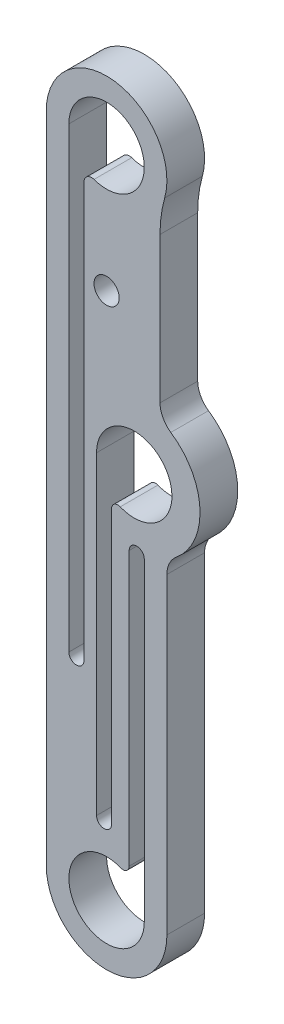
ISO-10303-21;
HEADER;
FILE_DESCRIPTION(('STEP AP214'),'2;1');
FILE_NAME('part.step','',(''),(''),'','','');
FILE_SCHEMA(('AUTOMOTIVE_DESIGN { 1 0 10303 214 1 1 1 1 }'));
ENDSEC;
DATA;
#1=APPLICATION_CONTEXT('core data for automotive mechanical design processes');
#2=APPLICATION_PROTOCOL_DEFINITION('international standard','automotive_design',2000,#1);
#3=PRODUCT_CONTEXT('',#1,'mechanical');
#4=PRODUCT('Part','Part','',(#3));
#5=PRODUCT_RELATED_PRODUCT_CATEGORY('part','',(#4));
#6=PRODUCT_DEFINITION_FORMATION('','',#4);
#7=PRODUCT_DEFINITION_CONTEXT('part definition',#1,'design');
#8=PRODUCT_DEFINITION('design','',#6,#7);
#9=PRODUCT_DEFINITION_SHAPE('','',#8);
#10=(LENGTH_UNIT() NAMED_UNIT(*) SI_UNIT(.MILLI.,.METRE.));
#11=(NAMED_UNIT(*) PLANE_ANGLE_UNIT() SI_UNIT($,.RADIAN.));
#12=(NAMED_UNIT(*) SI_UNIT($,.STERADIAN.) SOLID_ANGLE_UNIT());
#13=UNCERTAINTY_MEASURE_WITH_UNIT(LENGTH_MEASURE(1.E-05),#10,'distance_accuracy_value','');
#14=(GEOMETRIC_REPRESENTATION_CONTEXT(3) GLOBAL_UNCERTAINTY_ASSIGNED_CONTEXT((#13)) GLOBAL_UNIT_ASSIGNED_CONTEXT((#10,
#11,#12)) REPRESENTATION_CONTEXT('',''));
#15=CARTESIAN_POINT('',(0.,0.,0.));
#16=DIRECTION('',(0.,0.,1.));
#17=DIRECTION('',(1.,0.,0.));
#18=AXIS2_PLACEMENT_3D('',#15,#16,#17);
#19=CARTESIAN_POINT('',(-379.175961005545,89.3777291781797,3.));
#20=DIRECTION('',(0.,0.,1.));
#21=DIRECTION('',(1.,0.,0.));
#22=AXIS2_PLACEMENT_3D('',#19,#20,#21);
#23=PLANE('',#22);
#24=CARTESIAN_POINT('',(-379.175961005545,37.3777291781797,3.));
#25=DIRECTION('',(0.,0.,1.));
#26=DIRECTION('',(1.,0.,0.));
#27=AXIS2_PLACEMENT_3D('',#24,#25,#26);
#28=CIRCLE('',#27,3.00000000000003);
#29=CARTESIAN_POINT('',(-378.061675291259,40.1631137740549,3.));
#30=VERTEX_POINT('',#29);
#31=CARTESIAN_POINT('',(-376.175961005545,37.3777291781797,3.));
#32=VERTEX_POINT('',#31);
#33=EDGE_CURVE('E286',#30,#32,#28,.T.);
#34=ORIENTED_EDGE('',*,*,#33,.F.);
#35=CARTESIAN_POINT('',(-377.875961005545,40.6273445400341,3.));
#36=DIRECTION('',(0.,0.,-1.));
#37=DIRECTION('',(-1.,0.,0.));
#38=AXIS2_PLACEMENT_3D('',#35,#36,#37);
#39=CIRCLE('',#38,0.499999999999999);
#40=CARTESIAN_POINT('',(-377.375961005545,40.6273445400341,3.));
#41=VERTEX_POINT('',#40);
#42=EDGE_CURVE('E284',#41,#30,#39,.T.);
#43=ORIENTED_EDGE('',*,*,#42,.F.);
#44=DIRECTION('',(0.,-1.,0.));
#45=VECTOR('',#44,1.);
#46=CARTESIAN_POINT('',(-377.375961005545,62.3777291781797,3.));
#47=LINE('',#46,#45);
#48=CARTESIAN_POINT('',(-377.375961005545,62.3777291781797,3.));
#49=VERTEX_POINT('',#48);
#50=EDGE_CURVE('E294',#49,#41,#47,.T.);
#51=ORIENTED_EDGE('',*,*,#50,.F.);
#52=CARTESIAN_POINT('',(-376.775961005545,62.3777291781797,3.));
#53=DIRECTION('',(0.,0.,1.));
#54=DIRECTION('',(1.,0.,0.));
#55=AXIS2_PLACEMENT_3D('',#52,#53,#54);
#56=CIRCLE('',#55,0.600000000000017);
#57=CARTESIAN_POINT('',(-376.175961005545,62.3777291781797,3.));
#58=VERTEX_POINT('',#57);
#59=EDGE_CURVE('E291',#58,#49,#56,.T.);
#60=ORIENTED_EDGE('',*,*,#59,.F.);
#61=DIRECTION('',(0.,1.,0.));
#62=VECTOR('',#61,1.);
#63=CARTESIAN_POINT('',(-376.175961005545,37.3777291781797,3.));
#64=LINE('',#63,#62);
#65=EDGE_CURVE('E289',#32,#58,#64,.T.);
#66=ORIENTED_EDGE('',*,*,#65,.F.);
#67=EDGE_LOOP('',(#34,#43,#51,#60,#66));
#68=FACE_BOUND('',#67,.T.);
#69=CARTESIAN_POINT('',(-379.175961005545,89.3777291781797,3.));
#70=DIRECTION('',(0.,0.,1.));
#71=DIRECTION('',(1.,0.,0.));
#72=AXIS2_PLACEMENT_3D('',#69,#70,#71);
#73=CIRCLE('',#72,4.79999999999992);
#74=CARTESIAN_POINT('',(-374.554571082855,88.080518639191,3.));
#75=VERTEX_POINT('',#74);
#76=CARTESIAN_POINT('',(-383.975961005545,89.3777291781797,3.));
#77=VERTEX_POINT('',#76);
#78=EDGE_CURVE('E322',#75,#77,#73,.T.);
#79=ORIENTED_EDGE('',*,*,#78,.T.);
#80=DIRECTION('',(0.,-1.,0.));
#81=VECTOR('',#80,1.);
#82=CARTESIAN_POINT('',(-383.975961005545,89.3777291781797,3.));
#83=LINE('',#82,#81);
#84=CARTESIAN_POINT('',(-383.975961005545,37.3777291781797,3.));
#85=VERTEX_POINT('',#84);
#86=EDGE_CURVE('E325',#77,#85,#83,.T.);
#87=ORIENTED_EDGE('',*,*,#86,.T.);
#88=CARTESIAN_POINT('',(-379.175961005545,37.3777291781797,3.));
#89=DIRECTION('',(0.,0.,1.));
#90=DIRECTION('',(1.,0.,0.));
#91=AXIS2_PLACEMENT_3D('',#88,#89,#90);
#92=CIRCLE('',#91,4.80000000000008);
#93=CARTESIAN_POINT('',(-374.375961005544,37.3777291781797,3.));
#94=VERTEX_POINT('',#93);
#95=EDGE_CURVE('E328',#85,#94,#92,.T.);
#96=ORIENTED_EDGE('',*,*,#95,.T.);
#97=DIRECTION('',(0.,1.,0.));
#98=VECTOR('',#97,1.);
#99=CARTESIAN_POINT('',(-374.375961005544,37.3777291781797,3.));
#100=LINE('',#99,#98);
#101=CARTESIAN_POINT('',(-374.375961005545,62.2241193920529,3.));
#102=VERTEX_POINT('',#101);
#103=EDGE_CURVE('E330',#94,#102,#100,.T.);
#104=ORIENTED_EDGE('',*,*,#103,.T.);
#105=CARTESIAN_POINT('',(-372.375961005545,62.2241193920529,3.));
#106=DIRECTION('',(0.,0.,-1.));
#107=DIRECTION('',(1.,0.,0.));
#108=AXIS2_PLACEMENT_3D('',#105,#106,#107);
#109=CIRCLE('',#108,1.99999999999996);
#110=CARTESIAN_POINT('',(-373.647205362335,63.7681199702032,3.));
#111=VERTEX_POINT('',#110);
#112=EDGE_CURVE('E332',#102,#111,#109,.T.);
#113=ORIENTED_EDGE('',*,*,#112,.T.);
#114=CARTESIAN_POINT('',(-376.975961005545,67.8110882714461,3.));
#115=DIRECTION('',(0.,0.,1.));
#116=DIRECTION('',(1.,0.,0.));
#117=AXIS2_PLACEMENT_3D('',#114,#115,#116);
#118=CIRCLE('',#117,5.23700361056355);
#119=CARTESIAN_POINT('',(-374.066514555231,72.1655489923408,3.));
#120=VERTEX_POINT('',#119);
#121=EDGE_CURVE('E334',#111,#120,#118,.T.);
#122=ORIENTED_EDGE('',*,*,#121,.T.);
#123=CARTESIAN_POINT('',(-372.927039383473,73.809202341726,3.));
#124=DIRECTION('',(0.,0.,-1.));
#125=DIRECTION('',(1.,0.,0.));
#126=AXIS2_PLACEMENT_3D('',#123,#124,#125);
#127=CIRCLE('',#126,2.00000000000002);
#128=CARTESIAN_POINT('',(-374.926675410585,73.7710479307991,3.));
#129=VERTEX_POINT('',#128);
#130=EDGE_CURVE('E336',#120,#129,#127,.T.);
#131=ORIENTED_EDGE('',*,*,#130,.T.);
#132=DIRECTION('',(0.,1.,0.));
#133=VECTOR('',#132,1.);
#134=CARTESIAN_POINT('',(-374.926675410585,73.7710479307991,3.));
#135=LINE('',#134,#133);
#136=CARTESIAN_POINT('',(-374.926675410585,85.3779966829647,3.));
#137=VERTEX_POINT('',#136);
#138=EDGE_CURVE('E338',#129,#137,#135,.T.);
#139=ORIENTED_EDGE('',*,*,#138,.T.);
#140=CARTESIAN_POINT('',(-364.926675410585,85.3779966829647,3.));
#141=DIRECTION('',(0.,0.,-1.));
#142=DIRECTION('',(1.,0.,0.));
#143=AXIS2_PLACEMENT_3D('',#140,#141,#142);
#144=CIRCLE('',#143,10.);
#145=EDGE_CURVE('E340',#137,#75,#144,.T.);
#146=ORIENTED_EDGE('',*,*,#145,.T.);
#147=EDGE_LOOP('',(#79,#87,#96,#104,#113,#122,#131,#139,#146));
#148=FACE_BOUND('',#147,.T.);
#149=CARTESIAN_POINT('',(-379.175961005545,79.3777291781797,3.));
#150=DIRECTION('',(0.,0.,1.));
#151=DIRECTION('',(1.,0.,0.));
#152=AXIS2_PLACEMENT_3D('',#149,#150,#151);
#153=CIRCLE('',#152,0.999999999999998);
#154=CARTESIAN_POINT('',(-378.175961005545,79.3777291781797,3.));
#155=VERTEX_POINT('',#154);
#156=EDGE_CURVE('E278',#155,#155,#153,.T.);
#157=ORIENTED_EDGE('',*,*,#156,.F.);
#158=EDGE_LOOP('',(#157));
#159=FACE_BOUND('',#158,.T.);
#160=DIRECTION('',(0.,-1.,0.));
#161=VECTOR('',#160,1.);
#162=CARTESIAN_POINT('',(-382.175961005545,89.3777291781797,3.));
#163=LINE('',#162,#161);
#164=CARTESIAN_POINT('',(-382.175961005545,89.3777291781797,3.));
#165=VERTEX_POINT('',#164);
#166=CARTESIAN_POINT('',(-382.175961005545,52.9799389704528,3.));
#167=VERTEX_POINT('',#166);
#168=EDGE_CURVE('E242',#165,#167,#163,.T.);
#169=ORIENTED_EDGE('',*,*,#168,.F.);
#170=CARTESIAN_POINT('',(-379.175961005545,89.3777291781797,3.));
#171=DIRECTION('',(0.,0.,1.));
#172=DIRECTION('',(1.,0.,0.));
#173=AXIS2_PLACEMENT_3D('',#170,#171,#172);
#174=CIRCLE('',#173,2.99999999999989);
#175=CARTESIAN_POINT('',(-380.175961005544,86.5493020534335,3.));
#176=VERTEX_POINT('',#175);
#177=EDGE_CURVE('E240',#176,#165,#174,.T.);
#178=ORIENTED_EDGE('',*,*,#177,.F.);
#179=CARTESIAN_POINT('',(-380.362107087582,85.9643522532459,3.));
#180=DIRECTION('',(0.,0.,-1.));
#181=DIRECTION('',(1.,0.,0.));
#182=AXIS2_PLACEMENT_3D('',#179,#180,#181);
#183=CIRCLE('',#182,0.613853917962211);
#184=CARTESIAN_POINT('',(-380.975961005545,85.9643522532459,3.));
#185=VERTEX_POINT('',#184);
#186=EDGE_CURVE('E250',#185,#176,#183,.T.);
#187=ORIENTED_EDGE('',*,*,#186,.F.);
#188=DIRECTION('',(0.,1.,0.));
#189=VECTOR('',#188,1.);
#190=CARTESIAN_POINT('',(-380.975961005545,52.9799389704528,3.));
#191=LINE('',#190,#189);
#192=CARTESIAN_POINT('',(-380.975961005545,52.9799389704528,3.));
#193=VERTEX_POINT('',#192);
#194=EDGE_CURVE('E247',#193,#185,#191,.T.);
#195=ORIENTED_EDGE('',*,*,#194,.F.);
#196=CARTESIAN_POINT('',(-381.575961005545,52.9799389704528,3.));
#197=DIRECTION('',(0.,0.,1.));
#198=DIRECTION('',(1.,0.,0.));
#199=AXIS2_PLACEMENT_3D('',#196,#197,#198);
#200=CIRCLE('',#199,0.600000000000017);
#201=EDGE_CURVE('E245',#167,#193,#200,.T.);
#202=ORIENTED_EDGE('',*,*,#201,.F.);
#203=EDGE_LOOP('',(#169,#178,#187,#195,#202));
#204=FACE_BOUND('',#203,.T.);
#205=DIRECTION('',(0.,1.,0.));
#206=VECTOR('',#205,1.);
#207=CARTESIAN_POINT('',(-378.775961005545,42.8110882714463,3.));
#208=LINE('',#207,#206);
#209=CARTESIAN_POINT('',(-378.775961005545,42.8110882714463,3.));
#210=VERTEX_POINT('',#209);
#211=CARTESIAN_POINT('',(-378.775961005545,64.5614729095919,3.));
#212=VERTEX_POINT('',#211);
#213=EDGE_CURVE('E204',#210,#212,#208,.T.);
#214=ORIENTED_EDGE('',*,*,#213,.F.);
#215=CARTESIAN_POINT('',(-379.375961005545,42.8110882714461,3.));
#216=DIRECTION('',(0.,0.,1.));
#217=DIRECTION('',(1.,0.,0.));
#218=AXIS2_PLACEMENT_3D('',#215,#216,#217);
#219=CIRCLE('',#218,0.599999999999989);
#220=CARTESIAN_POINT('',(-379.975961005545,42.8110882714463,3.));
#221=VERTEX_POINT('',#220);
#222=EDGE_CURVE('E196',#221,#210,#219,.T.);
#223=ORIENTED_EDGE('',*,*,#222,.F.);
#224=DIRECTION('',(0.,-1.,0.));
#225=VECTOR('',#224,1.);
#226=CARTESIAN_POINT('',(-379.975961005545,67.8110882714462,3.));
#227=LINE('',#226,#225);
#228=CARTESIAN_POINT('',(-379.975961005545,67.8110882714462,3.));
#229=VERTEX_POINT('',#228);
#230=EDGE_CURVE('E223',#229,#221,#227,.T.);
#231=ORIENTED_EDGE('',*,*,#230,.F.);
#232=CARTESIAN_POINT('',(-376.975961005545,67.8110882714461,3.));
#233=DIRECTION('',(0.,0.,1.));
#234=DIRECTION('',(1.,0.,0.));
#235=AXIS2_PLACEMENT_3D('',#232,#233,#234);
#236=CIRCLE('',#235,3.);
#237=CARTESIAN_POINT('',(-378.090246719831,65.0257036755709,3.));
#238=VERTEX_POINT('',#237);
#239=EDGE_CURVE('E219',#238,#229,#236,.T.);
#240=ORIENTED_EDGE('',*,*,#239,.F.);
#241=CARTESIAN_POINT('',(-378.275961005545,64.5614729095917,3.));
#242=DIRECTION('',(0.,0.,-1.));
#243=DIRECTION('',(1.,0.,0.));
#244=AXIS2_PLACEMENT_3D('',#241,#242,#243);
#245=CIRCLE('',#244,0.499999999999977);
#246=EDGE_CURVE('E217',#212,#238,#245,.T.);
#247=ORIENTED_EDGE('',*,*,#246,.F.);
#248=EDGE_LOOP('',(#214,#223,#231,#240,#247));
#249=FACE_BOUND('',#248,.T.);
#250=ADVANCED_FACE('F35',(#68,#148,#159,#204,#249),#23,.T.);
#251=CARTESIAN_POINT('',(-379.175961005545,89.3777291781797,0.));
#252=DIRECTION('',(0.,0.,1.));
#253=DIRECTION('',(1.,0.,0.));
#254=AXIS2_PLACEMENT_3D('',#251,#252,#253);
#255=PLANE('',#254);
#256=CARTESIAN_POINT('',(-379.175961005545,89.3777291781797,0.));
#257=DIRECTION('',(0.,0.,1.));
#258=DIRECTION('',(1.,0.,0.));
#259=AXIS2_PLACEMENT_3D('',#256,#257,#258);
#260=CIRCLE('',#259,2.99999999999989);
#261=CARTESIAN_POINT('',(-380.175961005544,86.5493020534335,0.));
#262=VERTEX_POINT('',#261);
#263=CARTESIAN_POINT('',(-382.175961005545,89.3777291781797,0.));
#264=VERTEX_POINT('',#263);
#265=EDGE_CURVE('E212',#262,#264,#260,.T.);
#266=ORIENTED_EDGE('',*,*,#265,.T.);
#267=DIRECTION('',(0.,-1.,0.));
#268=VECTOR('',#267,1.);
#269=CARTESIAN_POINT('',(-382.175961005545,89.3777291781797,0.));
#270=LINE('',#269,#268);
#271=CARTESIAN_POINT('',(-382.175961005545,52.9799389704528,0.));
#272=VERTEX_POINT('',#271);
#273=EDGE_CURVE('E255',#264,#272,#270,.T.);
#274=ORIENTED_EDGE('',*,*,#273,.T.);
#275=CARTESIAN_POINT('',(-381.575961005545,52.9799389704528,0.));
#276=DIRECTION('',(0.,0.,1.));
#277=DIRECTION('',(1.,0.,0.));
#278=AXIS2_PLACEMENT_3D('',#275,#276,#277);
#279=CIRCLE('',#278,0.600000000000017);
#280=CARTESIAN_POINT('',(-380.975961005545,52.9799389704528,0.));
#281=VERTEX_POINT('',#280);
#282=EDGE_CURVE('E258',#272,#281,#279,.T.);
#283=ORIENTED_EDGE('',*,*,#282,.T.);
#284=DIRECTION('',(0.,1.,0.));
#285=VECTOR('',#284,1.);
#286=CARTESIAN_POINT('',(-380.975961005545,52.9799389704528,0.));
#287=LINE('',#286,#285);
#288=CARTESIAN_POINT('',(-380.975961005545,85.9643522532459,0.));
#289=VERTEX_POINT('',#288);
#290=EDGE_CURVE('E261',#281,#289,#287,.T.);
#291=ORIENTED_EDGE('',*,*,#290,.T.);
#292=CARTESIAN_POINT('',(-380.362107087582,85.9643522532459,0.));
#293=DIRECTION('',(0.,0.,-1.));
#294=DIRECTION('',(1.,0.,0.));
#295=AXIS2_PLACEMENT_3D('',#292,#293,#294);
#296=CIRCLE('',#295,0.613853917962211);
#297=EDGE_CURVE('E243',#289,#262,#296,.T.);
#298=ORIENTED_EDGE('',*,*,#297,.T.);
#299=EDGE_LOOP('',(#266,#274,#283,#291,#298));
#300=FACE_BOUND('',#299,.T.);
#301=CARTESIAN_POINT('',(-379.175961005545,89.3777291781797,0.));
#302=DIRECTION('',(0.,0.,1.));
#303=DIRECTION('',(1.,0.,0.));
#304=AXIS2_PLACEMENT_3D('',#301,#302,#303);
#305=CIRCLE('',#304,4.79999999999992);
#306=CARTESIAN_POINT('',(-374.554571082855,88.080518639191,0.));
#307=VERTEX_POINT('',#306);
#308=CARTESIAN_POINT('',(-383.975961005545,89.3777291781797,0.));
#309=VERTEX_POINT('',#308);
#310=EDGE_CURVE('E321',#307,#309,#305,.T.);
#311=ORIENTED_EDGE('',*,*,#310,.F.);
#312=CARTESIAN_POINT('',(-364.926675410585,85.3779966829647,0.));
#313=DIRECTION('',(0.,0.,-1.));
#314=DIRECTION('',(1.,0.,0.));
#315=AXIS2_PLACEMENT_3D('',#312,#313,#314);
#316=CIRCLE('',#315,10.);
#317=CARTESIAN_POINT('',(-374.926675410585,85.3779966829647,0.));
#318=VERTEX_POINT('',#317);
#319=EDGE_CURVE('E326',#318,#307,#316,.T.);
#320=ORIENTED_EDGE('',*,*,#319,.F.);
#321=DIRECTION('',(0.,1.,0.));
#322=VECTOR('',#321,1.);
#323=CARTESIAN_POINT('',(-374.926675410585,73.7710479307991,0.));
#324=LINE('',#323,#322);
#325=CARTESIAN_POINT('',(-374.926675410585,73.7710479307991,0.));
#326=VERTEX_POINT('',#325);
#327=EDGE_CURVE('E357',#326,#318,#324,.T.);
#328=ORIENTED_EDGE('',*,*,#327,.F.);
#329=CARTESIAN_POINT('',(-372.927039383473,73.809202341726,0.));
#330=DIRECTION('',(0.,0.,-1.));
#331=DIRECTION('',(1.,0.,0.));
#332=AXIS2_PLACEMENT_3D('',#329,#330,#331);
#333=CIRCLE('',#332,2.00000000000002);
#334=CARTESIAN_POINT('',(-374.066514555231,72.1655489923408,0.));
#335=VERTEX_POINT('',#334);
#336=EDGE_CURVE('E355',#335,#326,#333,.T.);
#337=ORIENTED_EDGE('',*,*,#336,.F.);
#338=CARTESIAN_POINT('',(-376.975961005545,67.8110882714461,0.));
#339=DIRECTION('',(0.,0.,1.));
#340=DIRECTION('',(1.,0.,0.));
#341=AXIS2_PLACEMENT_3D('',#338,#339,#340);
#342=CIRCLE('',#341,5.23700361056355);
#343=CARTESIAN_POINT('',(-373.647205362335,63.7681199702032,0.));
#344=VERTEX_POINT('',#343);
#345=EDGE_CURVE('E353',#344,#335,#342,.T.);
#346=ORIENTED_EDGE('',*,*,#345,.F.);
#347=CARTESIAN_POINT('',(-372.375961005545,62.2241193920529,0.));
#348=DIRECTION('',(0.,0.,-1.));
#349=DIRECTION('',(1.,0.,0.));
#350=AXIS2_PLACEMENT_3D('',#347,#348,#349);
#351=CIRCLE('',#350,1.99999999999996);
#352=CARTESIAN_POINT('',(-374.375961005545,62.2241193920529,0.));
#353=VERTEX_POINT('',#352);
#354=EDGE_CURVE('E351',#353,#344,#351,.T.);
#355=ORIENTED_EDGE('',*,*,#354,.F.);
#356=DIRECTION('',(0.,1.,0.));
#357=VECTOR('',#356,1.);
#358=CARTESIAN_POINT('',(-374.375961005544,37.3777291781797,0.));
#359=LINE('',#358,#357);
#360=CARTESIAN_POINT('',(-374.375961005544,37.3777291781797,0.));
#361=VERTEX_POINT('',#360);
#362=EDGE_CURVE('E349',#361,#353,#359,.T.);
#363=ORIENTED_EDGE('',*,*,#362,.F.);
#364=CARTESIAN_POINT('',(-379.175961005545,37.3777291781797,0.));
#365=DIRECTION('',(0.,0.,1.));
#366=DIRECTION('',(1.,0.,0.));
#367=AXIS2_PLACEMENT_3D('',#364,#365,#366);
#368=CIRCLE('',#367,4.80000000000008);
#369=CARTESIAN_POINT('',(-383.975961005545,37.3777291781797,0.));
#370=VERTEX_POINT('',#369);
#371=EDGE_CURVE('E347',#370,#361,#368,.T.);
#372=ORIENTED_EDGE('',*,*,#371,.F.);
#373=DIRECTION('',(0.,-1.,0.));
#374=VECTOR('',#373,1.);
#375=CARTESIAN_POINT('',(-383.975961005545,52.2254556502812,0.));
#376=LINE('',#375,#374);
#377=EDGE_CURVE('E345',#309,#370,#376,.T.);
#378=ORIENTED_EDGE('',*,*,#377,.F.);
#379=EDGE_LOOP('',(#311,#320,#328,#337,#346,#355,#363,#372,#378));
#380=FACE_BOUND('',#379,.T.);
#381=CARTESIAN_POINT('',(-377.875961005545,40.6273445400341,0.));
#382=DIRECTION('',(0.,0.,-1.));
#383=DIRECTION('',(-1.,0.,0.));
#384=AXIS2_PLACEMENT_3D('',#381,#382,#383);
#385=CIRCLE('',#384,0.499999999999999);
#386=CARTESIAN_POINT('',(-377.375961005545,40.6273445400341,0.));
#387=VERTEX_POINT('',#386);
#388=CARTESIAN_POINT('',(-378.061675291259,40.1631137740549,0.));
#389=VERTEX_POINT('',#388);
#390=EDGE_CURVE('E281',#387,#389,#385,.T.);
#391=ORIENTED_EDGE('',*,*,#390,.T.);
#392=CARTESIAN_POINT('',(-379.175961005545,37.3777291781797,0.));
#393=DIRECTION('',(0.,0.,1.));
#394=DIRECTION('',(1.,0.,0.));
#395=AXIS2_PLACEMENT_3D('',#392,#393,#394);
#396=CIRCLE('',#395,3.00000000000003);
#397=CARTESIAN_POINT('',(-376.175961005545,37.3777291781797,0.));
#398=VERTEX_POINT('',#397);
#399=EDGE_CURVE('E299',#389,#398,#396,.T.);
#400=ORIENTED_EDGE('',*,*,#399,.T.);
#401=DIRECTION('',(0.,1.,0.));
#402=VECTOR('',#401,1.);
#403=CARTESIAN_POINT('',(-376.175961005545,37.3777291781797,0.));
#404=LINE('',#403,#402);
#405=CARTESIAN_POINT('',(-376.175961005545,62.3777291781797,0.));
#406=VERTEX_POINT('',#405);
#407=EDGE_CURVE('E302',#398,#406,#404,.T.);
#408=ORIENTED_EDGE('',*,*,#407,.T.);
#409=CARTESIAN_POINT('',(-376.775961005545,62.3777291781797,0.));
#410=DIRECTION('',(0.,0.,1.));
#411=DIRECTION('',(1.,0.,0.));
#412=AXIS2_PLACEMENT_3D('',#409,#410,#411);
#413=CIRCLE('',#412,0.600000000000017);
#414=CARTESIAN_POINT('',(-377.375961005545,62.3777291781797,0.));
#415=VERTEX_POINT('',#414);
#416=EDGE_CURVE('E305',#406,#415,#413,.T.);
#417=ORIENTED_EDGE('',*,*,#416,.T.);
#418=DIRECTION('',(0.,-1.,0.));
#419=VECTOR('',#418,1.);
#420=CARTESIAN_POINT('',(-377.375961005545,62.3777291781797,0.));
#421=LINE('',#420,#419);
#422=EDGE_CURVE('E287',#415,#387,#421,.T.);
#423=ORIENTED_EDGE('',*,*,#422,.T.);
#424=EDGE_LOOP('',(#391,#400,#408,#417,#423));
#425=FACE_BOUND('',#424,.T.);
#426=CARTESIAN_POINT('',(-379.175961005545,79.3777291781797,0.));
#427=DIRECTION('',(0.,0.,1.));
#428=DIRECTION('',(1.,0.,0.));
#429=AXIS2_PLACEMENT_3D('',#426,#427,#428);
#430=CIRCLE('',#429,0.999999999999998);
#431=CARTESIAN_POINT('',(-378.175961005545,79.3777291781797,0.));
#432=VERTEX_POINT('',#431);
#433=EDGE_CURVE('E277',#432,#432,#430,.T.);
#434=ORIENTED_EDGE('',*,*,#433,.T.);
#435=EDGE_LOOP('',(#434));
#436=FACE_BOUND('',#435,.T.);
#437=CARTESIAN_POINT('',(-379.375961005545,42.8110882714461,0.));
#438=DIRECTION('',(0.,0.,1.));
#439=DIRECTION('',(1.,0.,0.));
#440=AXIS2_PLACEMENT_3D('',#437,#438,#439);
#441=CIRCLE('',#440,0.599999999999989);
#442=CARTESIAN_POINT('',(-379.975961005545,42.8110882714463,0.));
#443=VERTEX_POINT('',#442);
#444=CARTESIAN_POINT('',(-378.775961005545,42.8110882714463,0.));
#445=VERTEX_POINT('',#444);
#446=EDGE_CURVE('E58',#443,#445,#441,.T.);
#447=ORIENTED_EDGE('',*,*,#446,.T.);
#448=DIRECTION('',(0.,1.,0.));
#449=VECTOR('',#448,1.);
#450=CARTESIAN_POINT('',(-378.775961005545,42.8110882714463,0.));
#451=LINE('',#450,#449);
#452=CARTESIAN_POINT('',(-378.775961005545,64.5614729095919,0.));
#453=VERTEX_POINT('',#452);
#454=EDGE_CURVE('E211',#445,#453,#451,.T.);
#455=ORIENTED_EDGE('',*,*,#454,.T.);
#456=CARTESIAN_POINT('',(-378.275961005545,64.5614729095917,0.));
#457=DIRECTION('',(0.,0.,-1.));
#458=DIRECTION('',(1.,0.,0.));
#459=AXIS2_PLACEMENT_3D('',#456,#457,#458);
#460=CIRCLE('',#459,0.499999999999977);
#461=CARTESIAN_POINT('',(-378.090246719831,65.0257036755709,0.));
#462=VERTEX_POINT('',#461);
#463=EDGE_CURVE('E227',#453,#462,#460,.T.);
#464=ORIENTED_EDGE('',*,*,#463,.T.);
#465=CARTESIAN_POINT('',(-376.975961005545,67.8110882714461,0.));
#466=DIRECTION('',(0.,0.,1.));
#467=DIRECTION('',(1.,0.,0.));
#468=AXIS2_PLACEMENT_3D('',#465,#466,#467);
#469=CIRCLE('',#468,3.);
#470=CARTESIAN_POINT('',(-379.975961005545,67.8110882714462,0.));
#471=VERTEX_POINT('',#470);
#472=EDGE_CURVE('E230',#462,#471,#469,.T.);
#473=ORIENTED_EDGE('',*,*,#472,.T.);
#474=DIRECTION('',(0.,-1.,0.));
#475=VECTOR('',#474,1.);
#476=CARTESIAN_POINT('',(-379.975961005545,67.8110882714462,0.));
#477=LINE('',#476,#475);
#478=EDGE_CURVE('E205',#471,#443,#477,.T.);
#479=ORIENTED_EDGE('',*,*,#478,.T.);
#480=EDGE_LOOP('',(#447,#455,#464,#473,#479));
#481=FACE_BOUND('',#480,.T.);
#482=ADVANCED_FACE('F390',(#300,#380,#425,#436,#481),#255,.F.);
#483=CARTESIAN_POINT('',(-379.175961005545,89.3777291781797,3.));
#484=DIRECTION('',(0.,0.,-1.));
#485=DIRECTION('',(-1.,0.,0.));
#486=AXIS2_PLACEMENT_3D('',#483,#484,#485);
#487=CYLINDRICAL_SURFACE('',#486,4.79999999999992);
#488=ORIENTED_EDGE('',*,*,#310,.T.);
#489=DIRECTION('',(0.,0.,-1.));
#490=VECTOR('',#489,1.);
#491=CARTESIAN_POINT('',(-383.975961005545,89.3777291781797,3.));
#492=LINE('',#491,#490);
#493=EDGE_CURVE('E11',#77,#309,#492,.T.);
#494=ORIENTED_EDGE('',*,*,#493,.F.);
#495=ORIENTED_EDGE('',*,*,#78,.F.);
#496=DIRECTION('',(0.,0.,-1.));
#497=VECTOR('',#496,1.);
#498=CARTESIAN_POINT('',(-374.554571082855,88.080518639191,3.));
#499=LINE('',#498,#497);
#500=EDGE_CURVE('E342',#75,#307,#499,.T.);
#501=ORIENTED_EDGE('',*,*,#500,.T.);
#502=EDGE_LOOP('',(#488,#494,#495,#501));
#503=FACE_BOUND('',#502,.T.);
#504=ADVANCED_FACE('F37',(#503),#487,.T.);
#505=CARTESIAN_POINT('',(-383.975961005545,52.2254556502812,3.));
#506=DIRECTION('',(1.,0.,0.));
#507=DIRECTION('',(0.,1.,0.));
#508=AXIS2_PLACEMENT_3D('',#505,#506,#507);
#509=PLANE('',#508);
#510=ORIENTED_EDGE('',*,*,#377,.T.);
#511=DIRECTION('',(0.,0.,-1.));
#512=VECTOR('',#511,1.);
#513=CARTESIAN_POINT('',(-383.975961005545,37.3777291781797,3.));
#514=LINE('',#513,#512);
#515=EDGE_CURVE('E43',#85,#370,#514,.T.);
#516=ORIENTED_EDGE('',*,*,#515,.F.);
#517=ORIENTED_EDGE('',*,*,#86,.F.);
#518=ORIENTED_EDGE('',*,*,#493,.T.);
#519=EDGE_LOOP('',(#510,#516,#517,#518));
#520=FACE_BOUND('',#519,.T.);
#521=ADVANCED_FACE('F408',(#520),#509,.F.);
#522=CARTESIAN_POINT('',(-379.175961005545,37.3777291781797,3.));
#523=DIRECTION('',(0.,0.,-1.));
#524=DIRECTION('',(-1.,0.,0.));
#525=AXIS2_PLACEMENT_3D('',#522,#523,#524);
#526=CYLINDRICAL_SURFACE('',#525,4.80000000000008);
#527=ORIENTED_EDGE('',*,*,#371,.T.);
#528=DIRECTION('',(0.,0.,-1.));
#529=VECTOR('',#528,1.);
#530=CARTESIAN_POINT('',(-374.375961005544,37.3777291781797,3.));
#531=LINE('',#530,#529);
#532=EDGE_CURVE('E377',#94,#361,#531,.T.);
#533=ORIENTED_EDGE('',*,*,#532,.F.);
#534=ORIENTED_EDGE('',*,*,#95,.F.);
#535=ORIENTED_EDGE('',*,*,#515,.T.);
#536=EDGE_LOOP('',(#527,#533,#534,#535));
#537=FACE_BOUND('',#536,.T.);
#538=ADVANCED_FACE('F384',(#537),#526,.T.);
#539=CARTESIAN_POINT('',(-374.375961005544,37.3777291781797,3.));
#540=DIRECTION('',(-1.,0.,0.));
#541=DIRECTION('',(0.,-1.,0.));
#542=AXIS2_PLACEMENT_3D('',#539,#540,#541);
#543=PLANE('',#542);
#544=ORIENTED_EDGE('',*,*,#362,.T.);
#545=DIRECTION('',(0.,0.,-1.));
#546=VECTOR('',#545,1.);
#547=CARTESIAN_POINT('',(-374.375961005545,62.2241193920529,3.));
#548=LINE('',#547,#546);
#549=EDGE_CURVE('E374',#102,#353,#548,.T.);
#550=ORIENTED_EDGE('',*,*,#549,.F.);
#551=ORIENTED_EDGE('',*,*,#103,.F.);
#552=ORIENTED_EDGE('',*,*,#532,.T.);
#553=EDGE_LOOP('',(#544,#550,#551,#552));
#554=FACE_BOUND('',#553,.T.);
#555=ADVANCED_FACE('F396',(#554),#543,.F.);
#556=CARTESIAN_POINT('',(-372.375961005545,62.2241193920529,3.));
#557=DIRECTION('',(0.,0.,-1.));
#558=DIRECTION('',(-1.,0.,0.));
#559=AXIS2_PLACEMENT_3D('',#556,#557,#558);
#560=CYLINDRICAL_SURFACE('',#559,1.99999999999996);
#561=ORIENTED_EDGE('',*,*,#354,.T.);
#562=DIRECTION('',(0.,0.,-1.));
#563=VECTOR('',#562,1.);
#564=CARTESIAN_POINT('',(-373.647205362335,63.7681199702032,3.));
#565=LINE('',#564,#563);
#566=EDGE_CURVE('E371',#111,#344,#565,.T.);
#567=ORIENTED_EDGE('',*,*,#566,.F.);
#568=ORIENTED_EDGE('',*,*,#112,.F.);
#569=ORIENTED_EDGE('',*,*,#549,.T.);
#570=EDGE_LOOP('',(#561,#567,#568,#569));
#571=FACE_BOUND('',#570,.T.);
#572=ADVANCED_FACE('F400',(#571),#560,.F.);
#573=CARTESIAN_POINT('',(-376.975961005545,67.8110882714461,3.));
#574=DIRECTION('',(0.,0.,-1.));
#575=DIRECTION('',(-1.,0.,0.));
#576=AXIS2_PLACEMENT_3D('',#573,#574,#575);
#577=CYLINDRICAL_SURFACE('',#576,5.23700361056355);
#578=ORIENTED_EDGE('',*,*,#345,.T.);
#579=DIRECTION('',(0.,0.,-1.));
#580=VECTOR('',#579,1.);
#581=CARTESIAN_POINT('',(-374.066514555231,72.1655489923408,3.));
#582=LINE('',#581,#580);
#583=EDGE_CURVE('E368',#120,#335,#582,.T.);
#584=ORIENTED_EDGE('',*,*,#583,.F.);
#585=ORIENTED_EDGE('',*,*,#121,.F.);
#586=ORIENTED_EDGE('',*,*,#566,.T.);
#587=EDGE_LOOP('',(#578,#584,#585,#586));
#588=FACE_BOUND('',#587,.T.);
#589=ADVANCED_FACE('F426',(#588),#577,.T.);
#590=CARTESIAN_POINT('',(-372.927039383473,73.809202341726,3.));
#591=DIRECTION('',(0.,0.,-1.));
#592=DIRECTION('',(-1.,0.,0.));
#593=AXIS2_PLACEMENT_3D('',#590,#591,#592);
#594=CYLINDRICAL_SURFACE('',#593,2.00000000000002);
#595=ORIENTED_EDGE('',*,*,#336,.T.);
#596=DIRECTION('',(0.,0.,-1.));
#597=VECTOR('',#596,1.);
#598=CARTESIAN_POINT('',(-374.926675410585,73.7710479307991,3.));
#599=LINE('',#598,#597);
#600=EDGE_CURVE('E365',#129,#326,#599,.T.);
#601=ORIENTED_EDGE('',*,*,#600,.F.);
#602=ORIENTED_EDGE('',*,*,#130,.F.);
#603=ORIENTED_EDGE('',*,*,#583,.T.);
#604=EDGE_LOOP('',(#595,#601,#602,#603));
#605=FACE_BOUND('',#604,.T.);
#606=ADVANCED_FACE('F424',(#605),#594,.F.);
#607=CARTESIAN_POINT('',(-374.926675410585,73.7710479307991,3.));
#608=DIRECTION('',(-1.,0.,0.));
#609=DIRECTION('',(0.,-1.,0.));
#610=AXIS2_PLACEMENT_3D('',#607,#608,#609);
#611=PLANE('',#610);
#612=ORIENTED_EDGE('',*,*,#327,.T.);
#613=DIRECTION('',(0.,0.,-1.));
#614=VECTOR('',#613,1.);
#615=CARTESIAN_POINT('',(-374.926675410585,85.3779966829647,3.));
#616=LINE('',#615,#614);
#617=EDGE_CURVE('E362',#137,#318,#616,.T.);
#618=ORIENTED_EDGE('',*,*,#617,.F.);
#619=ORIENTED_EDGE('',*,*,#138,.F.);
#620=ORIENTED_EDGE('',*,*,#600,.T.);
#621=EDGE_LOOP('',(#612,#618,#619,#620));
#622=FACE_BOUND('',#621,.T.);
#623=ADVANCED_FACE('F420',(#622),#611,.F.);
#624=CARTESIAN_POINT('',(-364.926675410585,85.3779966829647,3.));
#625=DIRECTION('',(0.,0.,-1.));
#626=DIRECTION('',(-1.,0.,0.));
#627=AXIS2_PLACEMENT_3D('',#624,#625,#626);
#628=CYLINDRICAL_SURFACE('',#627,10.);
#629=ORIENTED_EDGE('',*,*,#319,.T.);
#630=ORIENTED_EDGE('',*,*,#500,.F.);
#631=ORIENTED_EDGE('',*,*,#145,.F.);
#632=ORIENTED_EDGE('',*,*,#617,.T.);
#633=EDGE_LOOP('',(#629,#630,#631,#632));
#634=FACE_BOUND('',#633,.T.);
#635=ADVANCED_FACE('F415',(#634),#628,.F.);
#636=CARTESIAN_POINT('',(-377.875961005545,40.6273445400341,3.));
#637=DIRECTION('',(0.,0.,-1.));
#638=DIRECTION('',(-1.,0.,0.));
#639=AXIS2_PLACEMENT_3D('',#636,#637,#638);
#640=CYLINDRICAL_SURFACE('',#639,0.499999999999999);
#641=ORIENTED_EDGE('',*,*,#390,.F.);
#642=DIRECTION('',(0.,0.,-1.));
#643=VECTOR('',#642,1.);
#644=CARTESIAN_POINT('',(-377.375961005545,40.6273445400341,3.));
#645=LINE('',#644,#643);
#646=EDGE_CURVE('E296',#41,#387,#645,.T.);
#647=ORIENTED_EDGE('',*,*,#646,.F.);
#648=ORIENTED_EDGE('',*,*,#42,.T.);
#649=DIRECTION('',(0.,0.,-1.));
#650=VECTOR('',#649,1.);
#651=CARTESIAN_POINT('',(-378.061675291259,40.1631137740549,3.));
#652=LINE('',#651,#650);
#653=EDGE_CURVE('E318',#30,#389,#652,.T.);
#654=ORIENTED_EDGE('',*,*,#653,.T.);
#655=EDGE_LOOP('',(#641,#647,#648,#654));
#656=FACE_BOUND('',#655,.T.);
#657=ADVANCED_FACE('F445',(#656),#640,.T.);
#658=CARTESIAN_POINT('',(-379.175961005545,37.3777291781797,3.));
#659=DIRECTION('',(0.,0.,-1.));
#660=DIRECTION('',(-1.,0.,0.));
#661=AXIS2_PLACEMENT_3D('',#658,#659,#660);
#662=CYLINDRICAL_SURFACE('',#661,3.00000000000003);
#663=ORIENTED_EDGE('',*,*,#399,.F.);
#664=ORIENTED_EDGE('',*,*,#653,.F.);
#665=ORIENTED_EDGE('',*,*,#33,.T.);
#666=DIRECTION('',(0.,0.,-1.));
#667=VECTOR('',#666,1.);
#668=CARTESIAN_POINT('',(-376.175961005545,37.3777291781797,3.));
#669=LINE('',#668,#667);
#670=EDGE_CURVE('E316',#32,#398,#669,.T.);
#671=ORIENTED_EDGE('',*,*,#670,.T.);
#672=EDGE_LOOP('',(#663,#664,#665,#671));
#673=FACE_BOUND('',#672,.T.);
#674=ADVANCED_FACE('F465',(#673),#662,.F.);
#675=CARTESIAN_POINT('',(-376.175961005545,37.3777291781797,3.));
#676=DIRECTION('',(-1.,0.,0.));
#677=DIRECTION('',(0.,-1.,0.));
#678=AXIS2_PLACEMENT_3D('',#675,#676,#677);
#679=PLANE('',#678);
#680=ORIENTED_EDGE('',*,*,#407,.F.);
#681=ORIENTED_EDGE('',*,*,#670,.F.);
#682=ORIENTED_EDGE('',*,*,#65,.T.);
#683=DIRECTION('',(0.,0.,-1.));
#684=VECTOR('',#683,1.);
#685=CARTESIAN_POINT('',(-376.175961005545,62.3777291781797,3.));
#686=LINE('',#685,#684);
#687=EDGE_CURVE('E314',#58,#406,#686,.T.);
#688=ORIENTED_EDGE('',*,*,#687,.T.);
#689=EDGE_LOOP('',(#680,#681,#682,#688));
#690=FACE_BOUND('',#689,.T.);
#691=ADVANCED_FACE('F472',(#690),#679,.T.);
#692=CARTESIAN_POINT('',(-376.775961005545,62.3777291781797,3.));
#693=DIRECTION('',(0.,0.,-1.));
#694=DIRECTION('',(-1.,0.,0.));
#695=AXIS2_PLACEMENT_3D('',#692,#693,#694);
#696=CYLINDRICAL_SURFACE('',#695,0.600000000000017);
#697=ORIENTED_EDGE('',*,*,#416,.F.);
#698=ORIENTED_EDGE('',*,*,#687,.F.);
#699=ORIENTED_EDGE('',*,*,#59,.T.);
#700=DIRECTION('',(0.,0.,-1.));
#701=VECTOR('',#700,1.);
#702=CARTESIAN_POINT('',(-377.375961005545,62.3777291781797,3.));
#703=LINE('',#702,#701);
#704=EDGE_CURVE('E312',#49,#415,#703,.T.);
#705=ORIENTED_EDGE('',*,*,#704,.T.);
#706=EDGE_LOOP('',(#697,#698,#699,#705));
#707=FACE_BOUND('',#706,.T.);
#708=ADVANCED_FACE('F479',(#707),#696,.F.);
#709=CARTESIAN_POINT('',(-377.375961005545,62.3777291781797,3.));
#710=DIRECTION('',(1.,0.,0.));
#711=DIRECTION('',(0.,1.,0.));
#712=AXIS2_PLACEMENT_3D('',#709,#710,#711);
#713=PLANE('',#712);
#714=ORIENTED_EDGE('',*,*,#422,.F.);
#715=ORIENTED_EDGE('',*,*,#704,.F.);
#716=ORIENTED_EDGE('',*,*,#50,.T.);
#717=ORIENTED_EDGE('',*,*,#646,.T.);
#718=EDGE_LOOP('',(#714,#715,#716,#717));
#719=FACE_BOUND('',#718,.T.);
#720=ADVANCED_FACE('F487',(#719),#713,.T.);
#721=CARTESIAN_POINT('',(-379.175961005545,79.3777291781797,3.));
#722=DIRECTION('',(0.,0.,-1.));
#723=DIRECTION('',(-1.,0.,0.));
#724=AXIS2_PLACEMENT_3D('',#721,#722,#723);
#725=CYLINDRICAL_SURFACE('',#724,0.999999999999998);
#726=ORIENTED_EDGE('',*,*,#156,.T.);
#727=EDGE_LOOP('',(#726));
#728=FACE_BOUND('',#727,.T.);
#729=ORIENTED_EDGE('',*,*,#433,.F.);
#730=EDGE_LOOP('',(#729));
#731=FACE_BOUND('',#730,.T.);
#732=ADVANCED_FACE('F495',(#728,#731),#725,.F.);
#733=CARTESIAN_POINT('',(-379.175961005545,89.3777291781797,3.));
#734=DIRECTION('',(0.,0.,-1.));
#735=DIRECTION('',(-1.,0.,0.));
#736=AXIS2_PLACEMENT_3D('',#733,#734,#735);
#737=CYLINDRICAL_SURFACE('',#736,2.99999999999989);
#738=ORIENTED_EDGE('',*,*,#265,.F.);
#739=DIRECTION('',(0.,0.,-1.));
#740=VECTOR('',#739,1.);
#741=CARTESIAN_POINT('',(-380.175961005544,86.5493020534335,3.));
#742=LINE('',#741,#740);
#743=EDGE_CURVE('E252',#176,#262,#742,.T.);
#744=ORIENTED_EDGE('',*,*,#743,.F.);
#745=ORIENTED_EDGE('',*,*,#177,.T.);
#746=DIRECTION('',(0.,0.,-1.));
#747=VECTOR('',#746,1.);
#748=CARTESIAN_POINT('',(-382.175961005545,89.3777291781797,3.));
#749=LINE('',#748,#747);
#750=EDGE_CURVE('E274',#165,#264,#749,.T.);
#751=ORIENTED_EDGE('',*,*,#750,.T.);
#752=EDGE_LOOP('',(#738,#744,#745,#751));
#753=FACE_BOUND('',#752,.T.);
#754=ADVANCED_FACE('F503',(#753),#737,.F.);
#755=CARTESIAN_POINT('',(-382.175961005545,89.3777291781797,3.));
#756=DIRECTION('',(1.,0.,0.));
#757=DIRECTION('',(0.,0.,-1.));
#758=AXIS2_PLACEMENT_3D('',#755,#756,#757);
#759=PLANE('',#758);
#760=ORIENTED_EDGE('',*,*,#273,.F.);
#761=ORIENTED_EDGE('',*,*,#750,.F.);
#762=ORIENTED_EDGE('',*,*,#168,.T.);
#763=DIRECTION('',(0.,0.,-1.));
#764=VECTOR('',#763,1.);
#765=CARTESIAN_POINT('',(-382.175961005545,52.9799389704528,3.));
#766=LINE('',#765,#764);
#767=EDGE_CURVE('E272',#167,#272,#766,.T.);
#768=ORIENTED_EDGE('',*,*,#767,.T.);
#769=EDGE_LOOP('',(#760,#761,#762,#768));
#770=FACE_BOUND('',#769,.T.);
#771=ADVANCED_FACE('F511',(#770),#759,.T.);
#772=CARTESIAN_POINT('',(-381.575961005545,52.9799389704528,3.));
#773=DIRECTION('',(0.,0.,-1.));
#774=DIRECTION('',(-1.,0.,0.));
#775=AXIS2_PLACEMENT_3D('',#772,#773,#774);
#776=CYLINDRICAL_SURFACE('',#775,0.600000000000017);
#777=ORIENTED_EDGE('',*,*,#282,.F.);
#778=ORIENTED_EDGE('',*,*,#767,.F.);
#779=ORIENTED_EDGE('',*,*,#201,.T.);
#780=DIRECTION('',(0.,0.,-1.));
#781=VECTOR('',#780,1.);
#782=CARTESIAN_POINT('',(-380.975961005545,52.9799389704528,3.));
#783=LINE('',#782,#781);
#784=EDGE_CURVE('E270',#193,#281,#783,.T.);
#785=ORIENTED_EDGE('',*,*,#784,.T.);
#786=EDGE_LOOP('',(#777,#778,#779,#785));
#787=FACE_BOUND('',#786,.T.);
#788=ADVANCED_FACE('F519',(#787),#776,.F.);
#789=CARTESIAN_POINT('',(-380.975961005545,52.9799389704528,3.));
#790=DIRECTION('',(-1.,0.,0.));
#791=DIRECTION('',(0.,0.,1.));
#792=AXIS2_PLACEMENT_3D('',#789,#790,#791);
#793=PLANE('',#792);
#794=ORIENTED_EDGE('',*,*,#290,.F.);
#795=ORIENTED_EDGE('',*,*,#784,.F.);
#796=ORIENTED_EDGE('',*,*,#194,.T.);
#797=DIRECTION('',(0.,0.,-1.));
#798=VECTOR('',#797,1.);
#799=CARTESIAN_POINT('',(-380.975961005545,85.9643522532459,3.));
#800=LINE('',#799,#798);
#801=EDGE_CURVE('E268',#185,#289,#800,.T.);
#802=ORIENTED_EDGE('',*,*,#801,.T.);
#803=EDGE_LOOP('',(#794,#795,#796,#802));
#804=FACE_BOUND('',#803,.T.);
#805=ADVANCED_FACE('F527',(#804),#793,.T.);
#806=CARTESIAN_POINT('',(-380.362107087582,85.9643522532459,3.));
#807=DIRECTION('',(0.,0.,-1.));
#808=DIRECTION('',(-1.,0.,0.));
#809=AXIS2_PLACEMENT_3D('',#806,#807,#808);
#810=CYLINDRICAL_SURFACE('',#809,0.613853917962211);
#811=ORIENTED_EDGE('',*,*,#297,.F.);
#812=ORIENTED_EDGE('',*,*,#801,.F.);
#813=ORIENTED_EDGE('',*,*,#186,.T.);
#814=ORIENTED_EDGE('',*,*,#743,.T.);
#815=EDGE_LOOP('',(#811,#812,#813,#814));
#816=FACE_BOUND('',#815,.T.);
#817=ADVANCED_FACE('F535',(#816),#810,.T.);
#818=CARTESIAN_POINT('',(-379.375961005545,42.8110882714461,3.));
#819=DIRECTION('',(0.,0.,-1.));
#820=DIRECTION('',(-1.,0.,0.));
#821=AXIS2_PLACEMENT_3D('',#818,#819,#820);
#822=CYLINDRICAL_SURFACE('',#821,0.599999999999989);
#823=ORIENTED_EDGE('',*,*,#446,.F.);
#824=DIRECTION('',(0.,0.,-1.));
#825=VECTOR('',#824,1.);
#826=CARTESIAN_POINT('',(-379.975961005545,42.8110882714463,3.));
#827=LINE('',#826,#825);
#828=EDGE_CURVE('E200',#221,#443,#827,.T.);
#829=ORIENTED_EDGE('',*,*,#828,.F.);
#830=ORIENTED_EDGE('',*,*,#222,.T.);
#831=DIRECTION('',(0.,0.,-1.));
#832=VECTOR('',#831,1.);
#833=CARTESIAN_POINT('',(-378.775961005545,42.8110882714463,3.));
#834=LINE('',#833,#832);
#835=EDGE_CURVE('E199',#210,#445,#834,.T.);
#836=ORIENTED_EDGE('',*,*,#835,.T.);
#837=EDGE_LOOP('',(#823,#829,#830,#836));
#838=FACE_BOUND('',#837,.T.);
#839=ADVANCED_FACE('F198',(#838),#822,.F.);
#840=CARTESIAN_POINT('',(-378.775961005545,42.8110882714463,3.));
#841=DIRECTION('',(-1.,0.,0.));
#842=DIRECTION('',(0.,0.,1.));
#843=AXIS2_PLACEMENT_3D('',#840,#841,#842);
#844=PLANE('',#843);
#845=ORIENTED_EDGE('',*,*,#454,.F.);
#846=ORIENTED_EDGE('',*,*,#835,.F.);
#847=ORIENTED_EDGE('',*,*,#213,.T.);
#848=DIRECTION('',(0.,0.,-1.));
#849=VECTOR('',#848,1.);
#850=CARTESIAN_POINT('',(-378.775961005545,64.5614729095919,3.));
#851=LINE('',#850,#849);
#852=EDGE_CURVE('E213',#212,#453,#851,.T.);
#853=ORIENTED_EDGE('',*,*,#852,.T.);
#854=EDGE_LOOP('',(#845,#846,#847,#853));
#855=FACE_BOUND('',#854,.T.);
#856=ADVANCED_FACE('F208',(#855),#844,.T.);
#857=CARTESIAN_POINT('',(-378.275961005545,64.5614729095917,3.));
#858=DIRECTION('',(0.,0.,-1.));
#859=DIRECTION('',(-1.,0.,0.));
#860=AXIS2_PLACEMENT_3D('',#857,#858,#859);
#861=CYLINDRICAL_SURFACE('',#860,0.499999999999977);
#862=ORIENTED_EDGE('',*,*,#463,.F.);
#863=ORIENTED_EDGE('',*,*,#852,.F.);
#864=ORIENTED_EDGE('',*,*,#246,.T.);
#865=DIRECTION('',(0.,0.,-1.));
#866=VECTOR('',#865,1.);
#867=CARTESIAN_POINT('',(-378.090246719831,65.0257036755709,3.));
#868=LINE('',#867,#866);
#869=EDGE_CURVE('E237',#238,#462,#868,.T.);
#870=ORIENTED_EDGE('',*,*,#869,.T.);
#871=EDGE_LOOP('',(#862,#863,#864,#870));
#872=FACE_BOUND('',#871,.T.);
#873=ADVANCED_FACE('F556',(#872),#861,.T.);
#874=CARTESIAN_POINT('',(-376.975961005545,67.8110882714461,3.));
#875=DIRECTION('',(0.,0.,-1.));
#876=DIRECTION('',(-1.,0.,0.));
#877=AXIS2_PLACEMENT_3D('',#874,#875,#876);
#878=CYLINDRICAL_SURFACE('',#877,3.);
#879=ORIENTED_EDGE('',*,*,#472,.F.);
#880=ORIENTED_EDGE('',*,*,#869,.F.);
#881=ORIENTED_EDGE('',*,*,#239,.T.);
#882=DIRECTION('',(0.,0.,-1.));
#883=VECTOR('',#882,1.);
#884=CARTESIAN_POINT('',(-379.975961005545,67.8110882714462,3.));
#885=LINE('',#884,#883);
#886=EDGE_CURVE('E50',#229,#471,#885,.T.);
#887=ORIENTED_EDGE('',*,*,#886,.T.);
#888=EDGE_LOOP('',(#879,#880,#881,#887));
#889=FACE_BOUND('',#888,.T.);
#890=ADVANCED_FACE('F563',(#889),#878,.F.);
#891=CARTESIAN_POINT('',(-379.975961005545,67.8110882714462,3.));
#892=DIRECTION('',(1.,0.,0.));
#893=DIRECTION('',(0.,0.,-1.));
#894=AXIS2_PLACEMENT_3D('',#891,#892,#893);
#895=PLANE('',#894);
#896=ORIENTED_EDGE('',*,*,#478,.F.);
#897=ORIENTED_EDGE('',*,*,#886,.F.);
#898=ORIENTED_EDGE('',*,*,#230,.T.);
#899=ORIENTED_EDGE('',*,*,#828,.T.);
#900=EDGE_LOOP('',(#896,#897,#898,#899));
#901=FACE_BOUND('',#900,.T.);
#902=ADVANCED_FACE('F571',(#901),#895,.T.);
#903=CLOSED_SHELL('',(#250,#482,#504,#521,#538,#555,#572,#589,#606,#623,#635,#657,#674,#691,
#708,#720,#732,#754,#771,#788,#805,#817,#839,#856,#873,#890,#902));
#904=MANIFOLD_SOLID_BREP('B2',#903);
#905=ADVANCED_BREP_SHAPE_REPRESENTATION('',(#18,#904),#14);
#906=SHAPE_DEFINITION_REPRESENTATION(#9,#905);
ENDSEC;
END-ISO-10303-21;
